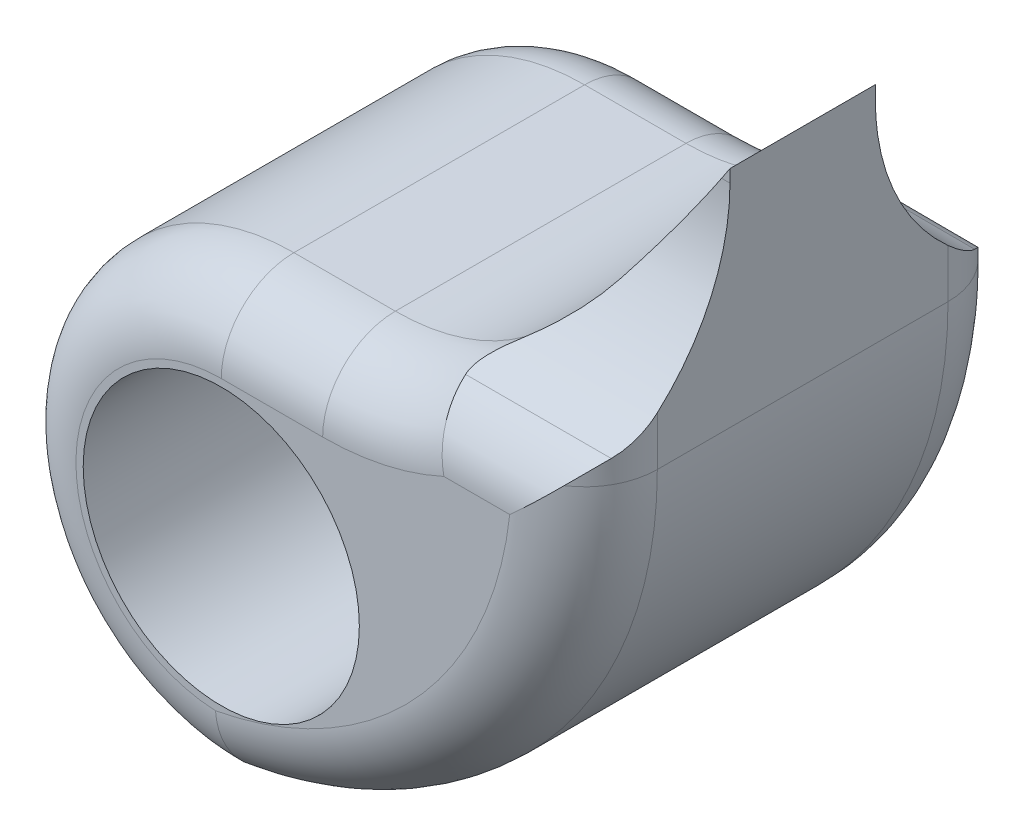
ISO-10303-21;
HEADER;
FILE_DESCRIPTION(('STEP AP214'),'2;1');
FILE_NAME('part.step','',(''),(''),'','','');
FILE_SCHEMA(('AUTOMOTIVE_DESIGN { 1 0 10303 214 1 1 1 1 }'));
ENDSEC;
DATA;
#1=APPLICATION_CONTEXT('core data for automotive mechanical design processes');
#2=APPLICATION_PROTOCOL_DEFINITION('international standard','automotive_design',2000,#1);
#3=PRODUCT_CONTEXT('',#1,'mechanical');
#4=PRODUCT('Part','Part','',(#3));
#5=PRODUCT_RELATED_PRODUCT_CATEGORY('part','',(#4));
#6=PRODUCT_DEFINITION_FORMATION('','',#4);
#7=PRODUCT_DEFINITION_CONTEXT('part definition',#1,'design');
#8=PRODUCT_DEFINITION('design','',#6,#7);
#9=PRODUCT_DEFINITION_SHAPE('','',#8);
#10=(LENGTH_UNIT() NAMED_UNIT(*) SI_UNIT(.MILLI.,.METRE.));
#11=(NAMED_UNIT(*) PLANE_ANGLE_UNIT() SI_UNIT($,.RADIAN.));
#12=(NAMED_UNIT(*) SI_UNIT($,.STERADIAN.) SOLID_ANGLE_UNIT());
#13=UNCERTAINTY_MEASURE_WITH_UNIT(LENGTH_MEASURE(1.E-05),#10,'distance_accuracy_value','');
#14=(GEOMETRIC_REPRESENTATION_CONTEXT(3) GLOBAL_UNCERTAINTY_ASSIGNED_CONTEXT((#13)) GLOBAL_UNIT_ASSIGNED_CONTEXT((#10,
#11,#12)) REPRESENTATION_CONTEXT('',''));
#15=CARTESIAN_POINT('',(0.,0.,0.));
#16=DIRECTION('',(0.,0.,1.));
#17=DIRECTION('',(1.,0.,0.));
#18=AXIS2_PLACEMENT_3D('',#15,#16,#17);
#19=CARTESIAN_POINT('',(5.,6.00246294667528,6.));
#20=DIRECTION('',(0.832569123861893,-0.553921162253114,0.));
#21=DIRECTION('',(0.553921162253114,0.832569123861893,0.));
#22=AXIS2_PLACEMENT_3D('',#19,#20,#21);
#23=PLANE('',#22);
#24=CARTESIAN_POINT('',(4.87991545972652,5.8219703291371,-0.999999999999999));
#25=DIRECTION('',(0.832569123861893,-0.553921162253114,0.));
#26=DIRECTION('',(0.553921162253114,0.832569123861893,0.));
#27=AXIS2_PLACEMENT_3D('',#24,#25,#26);
#28=ELLIPSE('',#27,3.59507871271554,3.);
#29=CARTESIAN_POINT('',(4.87991545972652,5.8219703291371,2.));
#30=VERTEX_POINT('',#29);
#31=CARTESIAN_POINT('',(3.89276431969464,4.33823651324066,1.60546508920253));
#32=VERTEX_POINT('',#31);
#33=EDGE_CURVE('E203',#30,#32,#28,.T.);
#34=ORIENTED_EDGE('',*,*,#33,.T.);
#35=DIRECTION('',(0.,0.,-1.));
#36=VECTOR('',#35,1.);
#37=CARTESIAN_POINT('',(3.89276431969464,4.33823651324066,4.));
#38=LINE('',#37,#36);
#39=CARTESIAN_POINT('',(3.89276431969464,4.33823651324066,4.39628497308531));
#40=VERTEX_POINT('',#39);
#41=EDGE_CURVE('E198',#32,#40,#38,.F.);
#42=ORIENTED_EDGE('',*,*,#41,.T.);
#43=CARTESIAN_POINT('',(4.88421126607545,5.82842712474619,7.));
#44=DIRECTION('',(0.832569123861893,-0.553921162253114,0.));
#45=DIRECTION('',(0.553921162253114,0.832569123861893,0.));
#46=AXIS2_PLACEMENT_3D('',#43,#44,#45);
#47=ELLIPSE('',#46,3.60330441523513,3.);
#48=CARTESIAN_POINT('',(4.88421126607545,5.82842712474619,4.));
#49=VERTEX_POINT('',#48);
#50=EDGE_CURVE('E209',#40,#49,#47,.T.);
#51=ORIENTED_EDGE('',*,*,#50,.T.);
#52=DIRECTION('',(-0.553921162253114,-0.832569123861893,0.));
#53=VECTOR('',#52,1.);
#54=CARTESIAN_POINT('',(5.,6.00246294667528,4.));
#55=LINE('',#54,#53);
#56=CARTESIAN_POINT('',(5.,6.00246294667528,4.));
#57=VERTEX_POINT('',#56);
#58=EDGE_CURVE('E178',#57,#49,#55,.T.);
#59=ORIENTED_EDGE('',*,*,#58,.F.);
#60=DIRECTION('',(0.,0.,-1.));
#61=VECTOR('',#60,1.);
#62=CARTESIAN_POINT('',(5.,6.00246294667528,6.));
#63=LINE('',#62,#61);
#64=CARTESIAN_POINT('',(5.,6.00246294667528,2.));
#65=VERTEX_POINT('',#64);
#66=EDGE_CURVE('E175',#57,#65,#63,.T.);
#67=ORIENTED_EDGE('',*,*,#66,.T.);
#68=DIRECTION('',(0.553921162253114,0.832569123861893,0.));
#69=VECTOR('',#68,1.);
#70=CARTESIAN_POINT('',(3.00241479370527,3.,2.));
#71=LINE('',#70,#69);
#72=EDGE_CURVE('E159',#30,#65,#71,.T.);
#73=ORIENTED_EDGE('',*,*,#72,.F.);
#74=EDGE_LOOP('',(#34,#42,#51,#59,#67,#73));
#75=FACE_BOUND('',#74,.T.);
#76=ADVANCED_FACE('F35',(#75),#23,.F.);
#77=CARTESIAN_POINT('',(0.,3.,6.));
#78=DIRECTION('',(0.,-1.,0.));
#79=DIRECTION('',(0.,0.,-1.));
#80=AXIS2_PLACEMENT_3D('',#77,#78,#79);
#81=PLANE('',#80);
#82=DIRECTION('',(0.,0.,-1.));
#83=VECTOR('',#82,1.);
#84=CARTESIAN_POINT('',(1.39505694810896,3.,2.));
#85=LINE('',#84,#83);
#86=CARTESIAN_POINT('',(1.39505694810896,3.,5.));
#87=VERTEX_POINT('',#86);
#88=CARTESIAN_POINT('',(1.39505694810896,3.,1.));
#89=VERTEX_POINT('',#88);
#90=EDGE_CURVE('E196',#87,#89,#85,.T.);
#91=ORIENTED_EDGE('',*,*,#90,.T.);
#92=DIRECTION('',(-1.,0.,0.));
#93=VECTOR('',#92,1.);
#94=CARTESIAN_POINT('',(0.,3.,1.));
#95=LINE('',#94,#93);
#96=CARTESIAN_POINT('',(0.,3.,1.));
#97=VERTEX_POINT('',#96);
#98=EDGE_CURVE('E11',#89,#97,#95,.T.);
#99=ORIENTED_EDGE('',*,*,#98,.T.);
#100=DIRECTION('',(0.,0.,-1.));
#101=VECTOR('',#100,1.);
#102=CARTESIAN_POINT('',(0.,3.,6.));
#103=LINE('',#102,#101);
#104=CARTESIAN_POINT('',(0.,3.,5.));
#105=VERTEX_POINT('',#104);
#106=EDGE_CURVE('E186',#105,#97,#103,.T.);
#107=ORIENTED_EDGE('',*,*,#106,.F.);
#108=DIRECTION('',(-1.,0.,0.));
#109=VECTOR('',#108,1.);
#110=CARTESIAN_POINT('',(0.,3.,5.));
#111=LINE('',#110,#109);
#112=EDGE_CURVE('E660',#105,#87,#111,.F.);
#113=ORIENTED_EDGE('',*,*,#112,.T.);
#114=EDGE_LOOP('',(#91,#99,#107,#113));
#115=FACE_BOUND('',#114,.T.);
#116=ADVANCED_FACE('F403',(#115),#81,.F.);
#117=CARTESIAN_POINT('',(0.,0.,6.));
#118=DIRECTION('',(0.,0.,-1.));
#119=DIRECTION('',(-1.,0.,0.));
#120=AXIS2_PLACEMENT_3D('',#117,#118,#119);
#121=CYLINDRICAL_SURFACE('',#120,3.);
#122=ORIENTED_EDGE('',*,*,#106,.T.);
#123=CARTESIAN_POINT('',(0.,0.,1.));
#124=DIRECTION('',(0.,0.,-1.));
#125=DIRECTION('',(-1.,0.,0.));
#126=AXIS2_PLACEMENT_3D('',#123,#124,#125);
#127=CIRCLE('',#126,3.);
#128=CARTESIAN_POINT('',(0.,-3.,1.));
#129=VERTEX_POINT('',#128);
#130=EDGE_CURVE('E329',#97,#129,#127,.F.);
#131=ORIENTED_EDGE('',*,*,#130,.T.);
#132=DIRECTION('',(0.,0.,-1.));
#133=VECTOR('',#132,1.);
#134=CARTESIAN_POINT('',(0.,-3.,6.));
#135=LINE('',#134,#133);
#136=CARTESIAN_POINT('',(0.,-3.,5.));
#137=VERTEX_POINT('',#136);
#138=EDGE_CURVE('E182',#137,#129,#135,.T.);
#139=ORIENTED_EDGE('',*,*,#138,.F.);
#140=CARTESIAN_POINT('',(0.,0.,5.));
#141=DIRECTION('',(0.,0.,-1.));
#142=DIRECTION('',(-1.,0.,0.));
#143=AXIS2_PLACEMENT_3D('',#140,#141,#142);
#144=CIRCLE('',#143,3.);
#145=EDGE_CURVE('E658',#137,#105,#144,.T.);
#146=ORIENTED_EDGE('',*,*,#145,.T.);
#147=EDGE_LOOP('',(#122,#131,#139,#146));
#148=FACE_BOUND('',#147,.T.);
#149=ADVANCED_FACE('F407',(#148),#121,.T.);
#150=CARTESIAN_POINT('',(5.,3.,6.));
#151=DIRECTION('',(-1.,0.,0.));
#152=DIRECTION('',(0.,0.,1.));
#153=AXIS2_PLACEMENT_3D('',#150,#151,#152);
#154=PLANE('',#153);
#155=DIRECTION('',(0.,0.,-1.));
#156=VECTOR('',#155,1.);
#157=CARTESIAN_POINT('',(5.,2.91607978309962,6.));
#158=LINE('',#157,#156);
#159=CARTESIAN_POINT('',(5.,2.91607978309962,5.));
#160=VERTEX_POINT('',#159);
#161=CARTESIAN_POINT('',(5.,2.91607978309962,1.));
#162=VERTEX_POINT('',#161);
#163=EDGE_CURVE('E211',#160,#162,#158,.T.);
#164=ORIENTED_EDGE('',*,*,#163,.T.);
#165=DIRECTION('',(0.,-1.,0.));
#166=VECTOR('',#165,1.);
#167=CARTESIAN_POINT('',(5.,2.91607978309962,1.));
#168=LINE('',#167,#166);
#169=CARTESIAN_POINT('',(5.,3.58547500913535,1.));
#170=VERTEX_POINT('',#169);
#171=EDGE_CURVE('E314',#162,#170,#168,.F.);
#172=ORIENTED_EDGE('',*,*,#171,.T.);
#173=CARTESIAN_POINT('',(5.,5.82155627851476,-0.999999999999999));
#174=DIRECTION('',(-1.,0.,0.));
#175=DIRECTION('',(0.,-1.,0.));
#176=AXIS2_PLACEMENT_3D('',#173,#174,#175);
#177=ELLIPSE('',#176,3.00001783292784,3.);
#178=CARTESIAN_POINT('',(5.,5.82155627851476,2.));
#179=VERTEX_POINT('',#178);
#180=EDGE_CURVE('E177',#170,#179,#177,.T.);
#181=ORIENTED_EDGE('',*,*,#180,.T.);
#182=DIRECTION('',(0.,-1.,0.));
#183=VECTOR('',#182,1.);
#184=CARTESIAN_POINT('',(5.,6.00246294667528,2.));
#185=LINE('',#184,#183);
#186=EDGE_CURVE('E162',#65,#179,#185,.T.);
#187=ORIENTED_EDGE('',*,*,#186,.F.);
#188=ORIENTED_EDGE('',*,*,#66,.F.);
#189=DIRECTION('',(0.,1.,0.));
#190=VECTOR('',#189,1.);
#191=CARTESIAN_POINT('',(5.,3.,4.));
#192=LINE('',#191,#190);
#193=CARTESIAN_POINT('',(5.,5.82842712474619,4.));
#194=VERTEX_POINT('',#193);
#195=EDGE_CURVE('E662',#194,#57,#192,.T.);
#196=ORIENTED_EDGE('',*,*,#195,.F.);
#197=CARTESIAN_POINT('',(5.,5.82842712474619,7.));
#198=DIRECTION('',(-1.,0.,0.));
#199=DIRECTION('',(0.,0.,1.));
#200=AXIS2_PLACEMENT_3D('',#197,#198,#199);
#201=CIRCLE('',#200,3.);
#202=CARTESIAN_POINT('',(5.,3.5923591472464,5.));
#203=VERTEX_POINT('',#202);
#204=EDGE_CURVE('E206',#194,#203,#201,.T.);
#205=ORIENTED_EDGE('',*,*,#204,.T.);
#206=DIRECTION('',(0.,1.,0.));
#207=VECTOR('',#206,1.);
#208=CARTESIAN_POINT('',(5.,3.,5.));
#209=LINE('',#208,#207);
#210=EDGE_CURVE('E450',#203,#160,#209,.F.);
#211=ORIENTED_EDGE('',*,*,#210,.T.);
#212=EDGE_LOOP('',(#164,#172,#181,#187,#188,#196,#205,#211));
#213=FACE_BOUND('',#212,.T.);
#214=ADVANCED_FACE('F173',(#213),#154,.F.);
#215=CARTESIAN_POINT('',(0.,0.,6.));
#216=DIRECTION('',(0.,0.,-1.));
#217=DIRECTION('',(-1.,0.,0.));
#218=AXIS2_PLACEMENT_3D('',#215,#216,#217);
#219=PLANE('',#218);
#220=CARTESIAN_POINT('',(1.39505694810896,6.,6.));
#221=DIRECTION('',(0.,0.,-1.));
#222=DIRECTION('',(-1.,0.,0.));
#223=AXIS2_PLACEMENT_3D('',#220,#221,#222);
#224=CIRCLE('',#223,4.);
#225=CARTESIAN_POINT('',(3.06295112937948,2.36432550960844,6.));
#226=VERTEX_POINT('',#225);
#227=CARTESIAN_POINT('',(1.39505694810896,2.,6.));
#228=VERTEX_POINT('',#227);
#229=EDGE_CURVE('E651',#226,#228,#224,.T.);
#230=ORIENTED_EDGE('',*,*,#229,.T.);
#231=DIRECTION('',(-1.,0.,0.));
#232=VECTOR('',#231,1.);
#233=CARTESIAN_POINT('',(0.,2.,6.));
#234=LINE('',#233,#232);
#235=CARTESIAN_POINT('',(0.,2.,6.));
#236=VERTEX_POINT('',#235);
#237=EDGE_CURVE('E656',#228,#236,#234,.T.);
#238=ORIENTED_EDGE('',*,*,#237,.T.);
#239=CARTESIAN_POINT('',(0.,0.,6.));
#240=DIRECTION('',(0.,0.,-1.));
#241=DIRECTION('',(-1.,0.,0.));
#242=AXIS2_PLACEMENT_3D('',#239,#240,#241);
#243=CIRCLE('',#242,2.);
#244=CARTESIAN_POINT('',(-0.0793304543605097,-1.99842605042342,6.));
#245=VERTEX_POINT('',#244);
#246=EDGE_CURVE('E653',#236,#245,#243,.F.);
#247=ORIENTED_EDGE('',*,*,#246,.T.);
#248=CARTESIAN_POINT('',(-1.,2.91607978309962,6.));
#249=DIRECTION('',(0.,0.,-1.));
#250=DIRECTION('',(-1.,0.,0.));
#251=AXIS2_PLACEMENT_3D('',#248,#249,#250);
#252=CIRCLE('',#251,5.);
#253=CARTESIAN_POINT('',(3.9694634742278,2.36432550960844,6.));
#254=VERTEX_POINT('',#253);
#255=EDGE_CURVE('E647',#245,#254,#252,.F.);
#256=ORIENTED_EDGE('',*,*,#255,.T.);
#257=DIRECTION('',(1.,0.,0.));
#258=VECTOR('',#257,1.);
#259=CARTESIAN_POINT('',(0.,2.36432550960844,6.));
#260=LINE('',#259,#258);
#261=EDGE_CURVE('E379',#254,#226,#260,.F.);
#262=ORIENTED_EDGE('',*,*,#261,.T.);
#263=EDGE_LOOP('',(#230,#238,#247,#256,#262));
#264=FACE_BOUND('',#263,.T.);
#265=CARTESIAN_POINT('',(0.,0.,6.));
#266=DIRECTION('',(0.,0.,1.));
#267=DIRECTION('',(1.,0.,0.));
#268=AXIS2_PLACEMENT_3D('',#265,#266,#267);
#269=CIRCLE('',#268,1.9);
#270=CARTESIAN_POINT('',(1.9,0.,6.));
#271=VERTEX_POINT('',#270);
#272=EDGE_CURVE('E189',#271,#271,#269,.T.);
#273=ORIENTED_EDGE('',*,*,#272,.F.);
#274=EDGE_LOOP('',(#273));
#275=FACE_BOUND('',#274,.T.);
#276=ADVANCED_FACE('F416',(#264,#275),#219,.F.);
#277=CARTESIAN_POINT('',(0.,0.,0.));
#278=DIRECTION('',(0.,0.,-1.));
#279=DIRECTION('',(-1.,0.,0.));
#280=AXIS2_PLACEMENT_3D('',#277,#278,#279);
#281=PLANE('',#280);
#282=CARTESIAN_POINT('',(0.,0.,0.));
#283=DIRECTION('',(0.,0.,-1.));
#284=DIRECTION('',(-1.,0.,0.));
#285=AXIS2_PLACEMENT_3D('',#282,#283,#284);
#286=CIRCLE('',#285,2.);
#287=CARTESIAN_POINT('',(-0.0793304543605097,-1.99842605042342,0.));
#288=VERTEX_POINT('',#287);
#289=CARTESIAN_POINT('',(0.,2.,0.));
#290=VERTEX_POINT('',#289);
#291=EDGE_CURVE('E320',#288,#290,#286,.T.);
#292=ORIENTED_EDGE('',*,*,#291,.T.);
#293=DIRECTION('',(-1.,0.,0.));
#294=VECTOR('',#293,1.);
#295=CARTESIAN_POINT('',(1.39505694810896,2.,0.));
#296=LINE('',#295,#294);
#297=CARTESIAN_POINT('',(1.39505694810896,2.,0.));
#298=VERTEX_POINT('',#297);
#299=EDGE_CURVE('E316',#290,#298,#296,.F.);
#300=ORIENTED_EDGE('',*,*,#299,.T.);
#301=CARTESIAN_POINT('',(1.39505694810896,6.,0.));
#302=DIRECTION('',(0.,0.,-1.));
#303=DIRECTION('',(-1.,0.,0.));
#304=AXIS2_PLACEMENT_3D('',#301,#302,#303);
#305=CIRCLE('',#304,4.);
#306=CARTESIAN_POINT('',(3.06249128513973,2.36411458765671,0.));
#307=VERTEX_POINT('',#306);
#308=EDGE_CURVE('E325',#298,#307,#305,.F.);
#309=ORIENTED_EDGE('',*,*,#308,.T.);
#310=DIRECTION('',(-0.999994055726055,0.00344797223827679,0.));
#311=VECTOR('',#310,1.);
#312=CARTESIAN_POINT('',(4.99780821200455,2.35744162895472,0.));
#313=LINE('',#312,#311);
#314=CARTESIAN_POINT('',(3.96909185041401,2.36098863549492,0.));
#315=VERTEX_POINT('',#314);
#316=EDGE_CURVE('E327',#307,#315,#313,.F.);
#317=ORIENTED_EDGE('',*,*,#316,.T.);
#318=CARTESIAN_POINT('',(-1.,2.91607978309962,0.));
#319=DIRECTION('',(0.,0.,-1.));
#320=DIRECTION('',(-1.,0.,0.));
#321=AXIS2_PLACEMENT_3D('',#318,#319,#320);
#322=CIRCLE('',#321,5.);
#323=EDGE_CURVE('E323',#315,#288,#322,.T.);
#324=ORIENTED_EDGE('',*,*,#323,.T.);
#325=EDGE_LOOP('',(#292,#300,#309,#317,#324));
#326=FACE_BOUND('',#325,.T.);
#327=CARTESIAN_POINT('',(0.,0.,0.));
#328=DIRECTION('',(0.,0.,1.));
#329=DIRECTION('',(1.,0.,0.));
#330=AXIS2_PLACEMENT_3D('',#327,#328,#329);
#331=CIRCLE('',#330,1.9);
#332=CARTESIAN_POINT('',(1.9,0.,0.));
#333=VERTEX_POINT('',#332);
#334=EDGE_CURVE('E183',#333,#333,#331,.T.);
#335=ORIENTED_EDGE('',*,*,#334,.T.);
#336=EDGE_LOOP('',(#335));
#337=FACE_BOUND('',#336,.T.);
#338=ADVANCED_FACE('F417',(#326,#337),#281,.T.);
#339=CARTESIAN_POINT('',(0.,0.,6.));
#340=DIRECTION('',(0.,0.,1.));
#341=DIRECTION('',(1.,0.,0.));
#342=AXIS2_PLACEMENT_3D('',#339,#340,#341);
#343=CYLINDRICAL_SURFACE('',#342,1.9);
#344=ORIENTED_EDGE('',*,*,#334,.F.);
#345=EDGE_LOOP('',(#344));
#346=FACE_BOUND('',#345,.T.);
#347=ORIENTED_EDGE('',*,*,#272,.T.);
#348=EDGE_LOOP('',(#347));
#349=FACE_BOUND('',#348,.T.);
#350=ADVANCED_FACE('F420',(#346,#349),#343,.F.);
#351=CARTESIAN_POINT('',(0.,0.,4.));
#352=DIRECTION('',(0.,0.,1.));
#353=DIRECTION('',(1.,0.,0.));
#354=AXIS2_PLACEMENT_3D('',#351,#352,#353);
#355=PLANE('',#354);
#356=ORIENTED_EDGE('',*,*,#58,.T.);
#357=DIRECTION('',(-1.,0.,0.));
#358=VECTOR('',#357,1.);
#359=CARTESIAN_POINT('',(5.,5.82842712474619,4.));
#360=LINE('',#359,#358);
#361=EDGE_CURVE('E201',#49,#194,#360,.F.);
#362=ORIENTED_EDGE('',*,*,#361,.T.);
#363=ORIENTED_EDGE('',*,*,#195,.T.);
#364=EDGE_LOOP('',(#356,#362,#363));
#365=FACE_BOUND('',#364,.T.);
#366=ADVANCED_FACE('F427',(#365),#355,.T.);
#367=CARTESIAN_POINT('',(0.,0.,2.));
#368=DIRECTION('',(0.,0.,1.));
#369=DIRECTION('',(1.,0.,0.));
#370=AXIS2_PLACEMENT_3D('',#367,#368,#369);
#371=PLANE('',#370);
#372=ORIENTED_EDGE('',*,*,#186,.T.);
#373=DIRECTION('',(0.999994055726055,-0.00344797223827679,0.));
#374=VECTOR('',#373,1.);
#375=CARTESIAN_POINT('',(0.0201318876778427,5.83872682758278,2.));
#376=LINE('',#375,#374);
#377=EDGE_CURVE('E164',#179,#30,#376,.F.);
#378=ORIENTED_EDGE('',*,*,#377,.T.);
#379=ORIENTED_EDGE('',*,*,#72,.T.);
#380=EDGE_LOOP('',(#372,#378,#379));
#381=FACE_BOUND('',#380,.T.);
#382=ADVANCED_FACE('F161',(#381),#371,.F.);
#383=CARTESIAN_POINT('',(0.,5.82842712474619,7.));
#384=DIRECTION('',(1.,0.,0.));
#385=DIRECTION('',(0.,0.,-1.));
#386=AXIS2_PLACEMENT_3D('',#383,#384,#385);
#387=CYLINDRICAL_SURFACE('',#386,3.);
#388=CARTESIAN_POINT('',(3.89276431969464,4.33823651324066,4.39628497308531));
#389=CARTESIAN_POINT('',(3.83977937249417,4.25862455525034,4.44185472319309));
#390=CARTESIAN_POINT('',(3.78379335400496,4.18270073973871,4.49014870818531));
#391=CARTESIAN_POINT('',(3.66667020364761,4.0382595686562,4.59104728764921));
#392=CARTESIAN_POINT('',(3.6055411630411,3.96973095247981,4.6436451076611));
#393=CARTESIAN_POINT('',(3.47895182447921,3.84000553957355,4.75204332682077));
#394=CARTESIAN_POINT('',(3.41350119445207,3.77879318418802,4.80783654268931));
#395=CARTESIAN_POINT('',(3.27862351863612,3.66332226380861,4.92180318658364));
#396=CARTESIAN_POINT('',(3.20919517406906,3.60906598900891,4.97997739024324));
#397=CARTESIAN_POINT('',(3.06718064685326,3.50769961688877,5.09732004263422));
#398=CARTESIAN_POINT('',(2.99462022725075,3.46054175931748,5.15647856880733));
#399=CARTESIAN_POINT('',(2.84590572394945,3.37273913670971,5.27516885582386));
#400=CARTESIAN_POINT('',(2.76975049050928,3.33209647397203,5.33470073072497));
#401=CARTESIAN_POINT('',(2.61347459248378,3.25719429284665,5.45285466261588));
#402=CARTESIAN_POINT('',(2.53334808187432,3.22294456118635,5.51147520074134));
#403=CARTESIAN_POINT('',(2.36855891434505,3.16097763643857,5.62562633234086));
#404=CARTESIAN_POINT('',(2.28390127117493,3.13325339901458,5.68116020795102));
#405=CARTESIAN_POINT('',(2.12584104316258,3.08945251985646,5.77518958418095));
#406=CARTESIAN_POINT('',(2.05350484401014,3.07215731241993,5.81488683474735));
#407=CARTESIAN_POINT('',(1.90453411741634,3.04261104596817,5.88613852989515));
#408=CARTESIAN_POINT('',(1.82794352461617,3.03031650658251,5.91776223415017));
#409=CARTESIAN_POINT('',(1.69230135168121,3.01422695715789,5.96044634206994));
#410=CARTESIAN_POINT('',(1.6345082853236,3.0090061771795,5.97480208115693));
#411=CARTESIAN_POINT('',(1.51629844436496,3.00184497945112,5.99476759467081));
#412=CARTESIAN_POINT('',(1.45585409905294,2.99996017509158,6.0002289759386));
#413=CARTESIAN_POINT('',(1.39505694810892,2.99999999999999,5.99999999999985));
#414=B_SPLINE_CURVE_WITH_KNOTS('',3,(#388,#389,#390,#391,#392,#393,#394,#395,#396,#397,#398,
#399,#400,#401,#402,#403,#404,#405,#406,#407,#408,#409,#410,#411,#412,#413),.UNSPECIFIED.,.F.,
.F.,(4,2,2,2,2,2,2,2,2,2,2,2,4),(0.,0.317518852050169,0.634547188079628,0.950888865943367,
1.26733442896142,1.58154526303849,1.89585728229567,2.21064659436109,2.52509451347435,
2.7776224706959,3.02790520020206,3.20651316601057,3.38807158029751),.UNSPECIFIED.);
#415=CARTESIAN_POINT('',(3.184823839118,3.59235914724629,4.99999999999999));
#416=VERTEX_POINT('',#415);
#417=EDGE_CURVE('E168',#416,#40,#414,.F.);
#418=ORIENTED_EDGE('',*,*,#417,.F.);
#419=CARTESIAN_POINT('',(3.18482383911792,3.59235914724639,5.));
#420=CARTESIAN_POINT('',(3.15814887247526,3.57248134527755,5.02223792086796));
#421=CARTESIAN_POINT('',(3.13178840338967,3.55269737668566,5.04501067630843));
#422=CARTESIAN_POINT('',(3.0799991940612,3.51284706403335,5.09236393610155));
#423=CARTESIAN_POINT('',(3.05459068209903,3.49278099427952,5.11696664115916));
#424=CARTESIAN_POINT('',(3.00369187165434,3.45069608545062,5.17034104001226));
#425=CARTESIAN_POINT('',(2.97839570788625,3.42866244899562,5.19928888851102));
#426=CARTESIAN_POINT('',(2.93233818357355,3.38420591039339,5.26011782866495));
#427=CARTESIAN_POINT('',(2.91154427919077,3.3617871594645,5.29197532855581));
#428=CARTESIAN_POINT('',(2.8862169485769,3.3271012262044,5.34354999227428));
#429=CARTESIAN_POINT('',(2.87864478137947,3.31504893795758,5.36188068654321));
#430=CARTESIAN_POINT('',(2.86692115834876,3.29104983234076,5.39931254169792));
#431=CARTESIAN_POINT('',(2.86271767731696,3.27910434588392,5.4183970089839));
#432=CARTESIAN_POINT('',(2.85954769834123,3.26104844784635,5.4479979307336));
#433=CARTESIAN_POINT('',(2.85904485411557,3.25484927209908,5.4582996071517));
#434=CARTESIAN_POINT('',(2.85932585532147,3.24251586557685,5.47907535040752));
#435=CARTESIAN_POINT('',(2.86012388038647,3.23638309390303,5.48955006848415));
#436=CARTESIAN_POINT('',(2.86163142858406,3.23035091339288,5.5));
#437=B_SPLINE_CURVE_WITH_KNOTS('',3,(#419,#420,#421,#422,#423,#424,#425,#426,#427,#428,#429,
#430,#431,#432,#433,#434,#435,#436),.UNSPECIFIED.,.F.,.F.,(4,2,2,2,2,2,2,2,4),(0.,
0.12010571516902,0.242035351400587,0.374820922201789,0.506612016005854,0.576055657562473,
0.644404964571219,0.680441634631158,0.716873741792013),.UNSPECIFIED.);
#438=CARTESIAN_POINT('',(2.86163142858406,3.23035091339287,5.5));
#439=VERTEX_POINT('',#438);
#440=EDGE_CURVE('E443',#416,#439,#437,.T.);
#441=ORIENTED_EDGE('',*,*,#440,.T.);
#442=DIRECTION('',(1.,0.,0.));
#443=VECTOR('',#442,1.);
#444=CARTESIAN_POINT('',(0.,3.23035091339287,5.5));
#445=LINE('',#444,#443);
#446=CARTESIAN_POINT('',(4.86602540378449,3.23035091339287,5.5));
#447=VERTEX_POINT('',#446);
#448=EDGE_CURVE('E452',#439,#447,#445,.T.);
#449=ORIENTED_EDGE('',*,*,#448,.T.);
#450=CARTESIAN_POINT('',(4.86602540378449,3.23035091339288,5.5));
#451=CARTESIAN_POINT('',(4.88154238236497,3.24586194804985,5.47312662632835));
#452=CARTESIAN_POINT('',(4.89559405171349,3.26214440758727,5.44589641166632));
#453=CARTESIAN_POINT('',(4.9208562628336,3.29616088546812,5.39106730236851));
#454=CARTESIAN_POINT('',(4.93206957728158,3.31389346466208,5.36346879547102));
#455=CARTESIAN_POINT('',(4.96123162565486,3.36843796076301,5.28166620969494));
#456=CARTESIAN_POINT('',(4.97531425432611,3.40722580376958,5.22735185168078));
#457=CARTESIAN_POINT('',(4.98997053509388,3.47081995714591,5.14444369895177));
#458=CARTESIAN_POINT('',(4.99376823507948,3.49413984503911,5.11518987465206));
#459=CARTESIAN_POINT('',(4.99879480176038,3.54223500825791,5.05712540675718));
#460=CARTESIAN_POINT('',(4.99999505885074,3.56702343305372,5.02832313403239));
#461=CARTESIAN_POINT('',(5.,3.5923591472464,5.));
#462=B_SPLINE_CURVE_WITH_KNOTS('',3,(#450,#451,#452,#453,#454,#455,#456,#457,#458,#459,#460,
#461),.UNSPECIFIED.,.F.,.F.,(4,2,2,2,2,4),(0.,0.103976758370557,0.207851550537422,
0.411431518668696,0.52414906425712,0.638101951910164),.UNSPECIFIED.);
#463=EDGE_CURVE('E376',#447,#203,#462,.T.);
#464=ORIENTED_EDGE('',*,*,#463,.T.);
#465=ORIENTED_EDGE('',*,*,#204,.F.);
#466=ORIENTED_EDGE('',*,*,#361,.F.);
#467=ORIENTED_EDGE('',*,*,#50,.F.);
#468=EDGE_LOOP('',(#418,#441,#449,#464,#465,#466,#467));
#469=FACE_BOUND('',#468,.T.);
#470=ADVANCED_FACE('F233',(#469),#387,.F.);
#471=CARTESIAN_POINT('',(1.39505694810896,6.,6.));
#472=DIRECTION('',(0.,0.,1.));
#473=DIRECTION('',(1.,0.,0.));
#474=AXIS2_PLACEMENT_3D('',#471,#472,#473);
#475=CYLINDRICAL_SURFACE('',#474,3.);
#476=CARTESIAN_POINT('',(3.89276431969464,4.33823651324066,1.60546508920253));
#477=CARTESIAN_POINT('',(3.83980280582881,4.25865913366388,1.55993513882468));
#478=CARTESIAN_POINT('',(3.78384737360799,4.18277468460517,1.51166412183856));
#479=CARTESIAN_POINT('',(3.66680906499894,4.03842349873449,1.41077497078089));
#480=CARTESIAN_POINT('',(3.60573437933852,3.96994529948507,1.35816378297033));
#481=CARTESIAN_POINT('',(3.47938444159621,3.84043266220568,1.24978353124635));
#482=CARTESIAN_POINT('',(3.41412582414749,3.77937123787362,1.19402706724494));
#483=CARTESIAN_POINT('',(3.27968299654902,3.66418651618762,1.08008954248297));
#484=CARTESIAN_POINT('',(3.21049745855341,3.61006558609323,1.02190766338174));
#485=CARTESIAN_POINT('',(3.0690377842788,3.50895715253966,0.904492790259504));
#486=CARTESIAN_POINT('',(2.99678933223866,3.46192131238532,0.845270315592093));
#487=CARTESIAN_POINT('',(2.84878272587129,3.37434211183944,0.726362607653325));
#488=CARTESIAN_POINT('',(2.7730235730266,3.33380061337045,0.666677246796517));
#489=CARTESIAN_POINT('',(2.61755697734354,3.25902144560633,0.547990298459437));
#490=CARTESIAN_POINT('',(2.53783914609142,3.22480160995406,0.488991072469048));
#491=CARTESIAN_POINT('',(2.37399249214122,3.16286252795234,0.373853994971432));
#492=CARTESIAN_POINT('',(2.28986822308576,3.13513672669253,0.317713303333782));
#493=CARTESIAN_POINT('',(2.12314432623742,3.08851047616079,0.216177327470284));
#494=CARTESIAN_POINT('',(2.04101003593291,3.06906438792932,0.17027557583169));
#495=CARTESIAN_POINT('',(1.87078059709399,3.03671445037384,0.0892335761997494));
#496=CARTESIAN_POINT('',(1.78274708382797,3.02375218791514,0.0539984152348801));
#497=CARTESIAN_POINT('',(1.65082380339574,3.01063916134976,0.0168316467948252));
#498=CARTESIAN_POINT('',(1.60935012122489,3.00736495868119,0.007248490681346));
#499=CARTESIAN_POINT('',(1.56729298346659,3.00494828957424,0.));
#500=B_SPLINE_CURVE_WITH_KNOTS('',3,(#476,#477,#478,#479,#480,#481,#482,#483,#484,#485,#486,
#487,#488,#489,#490,#491,#492,#493,#494,#495,#496,#497,#498,#499),.UNSPECIFIED.,.F.,.F.,(4,2,2,
2,2,2,2,2,2,2,2,4),(0.,0.317353253523584,0.634208099912081,0.94987313243706,1.26564554704945,
1.57915524809795,1.8927546718773,2.20722569441177,2.52137791679724,2.80914567560195,
3.09427199855078,3.22222780511188),.UNSPECIFIED.);
#501=CARTESIAN_POINT('',(3.1839860841132,3.59173661192225,1.00000000000001));
#502=VERTEX_POINT('',#501);
#503=EDGE_CURVE('E212',#502,#32,#500,.F.);
#504=ORIENTED_EDGE('',*,*,#503,.F.);
#505=CARTESIAN_POINT('',(1.39505694810896,6.,1.));
#506=DIRECTION('',(0.,0.,-1.));
#507=DIRECTION('',(-1.,0.,0.));
#508=AXIS2_PLACEMENT_3D('',#505,#506,#507);
#509=CIRCLE('',#508,3.);
#510=EDGE_CURVE('E46',#502,#89,#509,.T.);
#511=ORIENTED_EDGE('',*,*,#510,.T.);
#512=ORIENTED_EDGE('',*,*,#90,.F.);
#513=CARTESIAN_POINT('',(1.39505694810896,6.,5.));
#514=DIRECTION('',(0.,0.,-1.));
#515=DIRECTION('',(-1.,0.,0.));
#516=AXIS2_PLACEMENT_3D('',#513,#514,#515);
#517=CIRCLE('',#516,3.);
#518=EDGE_CURVE('E448',#87,#416,#517,.F.);
#519=ORIENTED_EDGE('',*,*,#518,.T.);
#520=ORIENTED_EDGE('',*,*,#417,.T.);
#521=ORIENTED_EDGE('',*,*,#41,.F.);
#522=EDGE_LOOP('',(#504,#511,#512,#519,#520,#521));
#523=FACE_BOUND('',#522,.T.);
#524=ADVANCED_FACE('F225',(#523),#475,.F.);
#525=CARTESIAN_POINT('',(5.00975233820411,5.8215226525235,-0.999999999999999));
#526=DIRECTION('',(0.999994055726055,-0.00344797223827679,0.));
#527=DIRECTION('',(0.00344797223827679,0.999994055726055,0.));
#528=AXIS2_PLACEMENT_3D('',#525,#526,#527);
#529=CYLINDRICAL_SURFACE('',#528,3.);
#530=ORIENTED_EDGE('',*,*,#180,.F.);
#531=CARTESIAN_POINT('',(5.,3.58547500913535,1.));
#532=CARTESIAN_POINT('',(5.00000179433018,3.55669581720317,0.967840682279425));
#533=CARTESIAN_POINT('',(4.99844775445451,3.52860720182796,0.935017991999093));
#534=CARTESIAN_POINT('',(4.99185821801216,3.4739573603603,0.868304242054488));
#535=CARTESIAN_POINT('',(4.98681233312382,3.44740094869276,0.834410283247736));
#536=CARTESIAN_POINT('',(4.97305479782106,3.39683421453748,0.766939815941447));
#537=CARTESIAN_POINT('',(4.9644466733762,3.37277426245193,0.733379781454431));
#538=CARTESIAN_POINT('',(4.943297561789,3.32665088926012,0.666193750615079));
#539=CARTESIAN_POINT('',(4.93076345916641,3.30458405966042,0.632567971347749));
#540=CARTESIAN_POINT('',(4.90887647726522,3.27313790819366,0.582538518359081));
#541=CARTESIAN_POINT('',(4.90107950180126,3.26294458466795,0.565953041446889));
#542=CARTESIAN_POINT('',(4.88438151067365,3.24304425152645,0.532864962793912));
#543=CARTESIAN_POINT('',(4.87547331168596,3.23334104298732,0.516363702786314));
#544=CARTESIAN_POINT('',(4.86602540378511,3.22392656682691,0.49999999999992));
#545=B_SPLINE_CURVE_WITH_KNOTS('',3,(#531,#532,#533,#534,#535,#536,#537,#538,#539,#540,#541,
#542,#543,#544),.UNSPECIFIED.,.F.,.F.,(4,2,2,2,2,2,4),(0.,0.129482629674841,0.259352138671123,
0.385686428498668,0.511800409646153,0.574682570475906,0.637994623065249),.UNSPECIFIED.);
#546=CARTESIAN_POINT('',(4.86602540378449,3.22392656682722,0.500000000000001));
#547=VERTEX_POINT('',#546);
#548=EDGE_CURVE('E245',#170,#547,#545,.T.);
#549=ORIENTED_EDGE('',*,*,#548,.T.);
#550=DIRECTION('',(0.999994055726055,-0.00344797223827679,0.));
#551=VECTOR('',#550,1.);
#552=CARTESIAN_POINT('',(5.00079424355444,3.22346188484691,0.500000000000001));
#553=LINE('',#552,#551);
#554=CARTESIAN_POINT('',(2.86254442884744,3.23083455467169,0.500000000000001));
#555=VERTEX_POINT('',#554);
#556=EDGE_CURVE('E246',#547,#555,#553,.F.);
#557=ORIENTED_EDGE('',*,*,#556,.T.);
#558=CARTESIAN_POINT('',(2.86254442884744,3.23083455467169,0.5));
#559=CARTESIAN_POINT('',(2.8594722097225,3.24296210666729,0.521010655123569));
#560=CARTESIAN_POINT('',(2.85934901875629,3.25541645751738,0.541970824758045));
#561=CARTESIAN_POINT('',(2.86378163550082,3.28029806315794,0.582760740686766));
#562=CARTESIAN_POINT('',(2.86822617654153,3.29271891106315,0.602605517703874));
#563=CARTESIAN_POINT('',(2.8833084055815,3.32302773927569,0.649856021557607));
#564=CARTESIAN_POINT('',(2.89583191674636,3.3408634973142,0.676650639803686));
#565=CARTESIAN_POINT('',(2.92542560594747,3.37646499915479,0.72846173675829));
#566=CARTESIAN_POINT('',(2.94258312603913,3.39422193125836,0.753430931477546));
#567=CARTESIAN_POINT('',(2.97747226206838,3.42741297084513,0.798722206016186));
#568=CARTESIAN_POINT('',(2.99491362129093,3.4428804051444,0.819249127001804));
#569=CARTESIAN_POINT('',(3.03122708236581,3.47369839652774,0.859124651267779));
#570=CARTESIAN_POINT('',(3.05010066310951,3.48904881428334,0.878471998327368));
#571=CARTESIAN_POINT('',(3.08785069647128,3.51894887805453,0.915252538964523));
#572=CARTESIAN_POINT('',(3.10668015357512,3.53350031534381,0.932733074871061));
#573=CARTESIAN_POINT('',(3.1449343717238,3.56259775449277,0.966908512841828));
#574=CARTESIAN_POINT('',(3.16435754133212,3.5771436804055,0.983605255028919));
#575=CARTESIAN_POINT('',(3.18398608411314,3.59173661192232,0.999999999999994));
#576=B_SPLINE_CURVE_WITH_KNOTS('',3,(#558,#559,#560,#561,#562,#563,#564,#565,#566,#567,#568,
#569,#570,#571,#572,#573,#574,#575),.UNSPECIFIED.,.F.,.F.,(4,2,2,2,2,2,2,2,4),(0.,
0.0728208999291297,0.143909032037648,0.24695206357272,0.352092114025014,0.445203359782971,
0.538412094565591,0.626976794154896,0.715321946647293),.UNSPECIFIED.);
#577=EDGE_CURVE('E240',#555,#502,#576,.T.);
#578=ORIENTED_EDGE('',*,*,#577,.T.);
#579=ORIENTED_EDGE('',*,*,#503,.T.);
#580=ORIENTED_EDGE('',*,*,#33,.F.);
#581=ORIENTED_EDGE('',*,*,#377,.F.);
#582=EDGE_LOOP('',(#530,#549,#557,#578,#579,#580,#581));
#583=FACE_BOUND('',#582,.T.);
#584=ADVANCED_FACE('F228',(#583),#529,.F.);
#585=CARTESIAN_POINT('',(-1.,2.91607978309962,6.));
#586=DIRECTION('',(0.,0.,-1.));
#587=DIRECTION('',(-1.,0.,0.));
#588=AXIS2_PLACEMENT_3D('',#585,#586,#587);
#589=CYLINDRICAL_SURFACE('',#588,6.);
#590=ORIENTED_EDGE('',*,*,#138,.T.);
#591=CARTESIAN_POINT('',(-1.,2.91607978309962,1.));
#592=DIRECTION('',(0.,0.,-1.));
#593=DIRECTION('',(-1.,0.,0.));
#594=AXIS2_PLACEMENT_3D('',#591,#592,#593);
#595=CIRCLE('',#594,6.);
#596=EDGE_CURVE('E315',#129,#162,#595,.F.);
#597=ORIENTED_EDGE('',*,*,#596,.T.);
#598=ORIENTED_EDGE('',*,*,#163,.F.);
#599=CARTESIAN_POINT('',(-1.,2.91607978309962,5.));
#600=DIRECTION('',(0.,0.,-1.));
#601=DIRECTION('',(-1.,0.,0.));
#602=AXIS2_PLACEMENT_3D('',#599,#600,#601);
#603=CIRCLE('',#602,6.);
#604=EDGE_CURVE('E332',#160,#137,#603,.T.);
#605=ORIENTED_EDGE('',*,*,#604,.T.);
#606=EDGE_LOOP('',(#590,#597,#598,#605));
#607=FACE_BOUND('',#606,.T.);
#608=ADVANCED_FACE('F231',(#607),#589,.T.);
#609=CARTESIAN_POINT('',(1.39505694810896,6.,5.));
#610=DIRECTION('',(0.,0.,-1.));
#611=DIRECTION('',(-1.,0.,0.));
#612=AXIS2_PLACEMENT_3D('',#609,#610,#611);
#613=TOROIDAL_SURFACE('',#612,4.,1.);
#614=CARTESIAN_POINT('',(1.39505694810896,2.,5.));
#615=DIRECTION('',(-1.,0.,0.));
#616=DIRECTION('',(0.,0.,1.));
#617=AXIS2_PLACEMENT_3D('',#614,#615,#616);
#618=CIRCLE('',#617,1.);
#619=EDGE_CURVE('E360',#228,#87,#618,.T.);
#620=ORIENTED_EDGE('',*,*,#619,.F.);
#621=ORIENTED_EDGE('',*,*,#229,.F.);
#622=CARTESIAN_POINT('',(2.86163142858406,3.23035091339288,5.5));
#623=CARTESIAN_POINT('',(2.86516133531058,3.21614122374328,5.52461180498429));
#624=CARTESIAN_POINT('',(2.86893370778017,3.20090456509371,5.54857822938141));
#625=CARTESIAN_POINT('',(2.87692368671607,3.1684937453816,5.59507745568024));
#626=CARTESIAN_POINT('',(2.881141205544,3.15131996564508,5.61761053837691));
#627=CARTESIAN_POINT('',(2.89437498198199,3.0971780262177,5.68271602192002));
#628=CARTESIAN_POINT('',(2.90399630222184,3.05749385611169,5.72295903908876));
#629=CARTESIAN_POINT('',(2.92446047177279,2.97216169530644,5.79604958626955));
#630=CARTESIAN_POINT('',(2.93530286559508,2.92651592741371,5.82889986032662));
#631=CARTESIAN_POINT('',(2.95785601859778,2.8304708543152,5.88647926961857));
#632=CARTESIAN_POINT('',(2.96956786945471,2.78006555076865,5.91119797614871));
#633=CARTESIAN_POINT('',(2.99448280821124,2.67157237734361,5.95355731090087));
#634=CARTESIAN_POINT('',(3.00772857767073,2.61319473903686,5.97043030022955));
#635=CARTESIAN_POINT('',(3.03432533925939,2.49449239602849,5.99332418846658));
#636=CARTESIAN_POINT('',(3.04767592007771,2.43417376299914,5.99937610681033));
#637=CARTESIAN_POINT('',(3.06155734653148,2.37070432029709,5.9999848116271));
#638=CARTESIAN_POINT('',(3.06225448905283,2.36751477971463,6.00000007591739));
#639=CARTESIAN_POINT('',(3.06295112937948,2.36432550960844,6.));
#640=B_SPLINE_CURVE_WITH_KNOTS('',3,(#622,#623,#624,#625,#626,#627,#628,#629,#630,#631,#632,
#633,#634,#635,#636,#637,#638,#639),.UNSPECIFIED.,.F.,.F.,(4,2,2,2,2,2,2,2,4),(0.,
0.0858570482402985,0.171697224754282,0.342810389686683,0.513859935536582,0.685128004228614,
0.870762228707681,1.05586346001582,1.06565791990553),.UNSPECIFIED.);
#641=EDGE_CURVE('E219',#439,#226,#640,.T.);
#642=ORIENTED_EDGE('',*,*,#641,.F.);
#643=ORIENTED_EDGE('',*,*,#440,.F.);
#644=ORIENTED_EDGE('',*,*,#518,.F.);
#645=EDGE_LOOP('',(#620,#621,#642,#643,#644));
#646=FACE_BOUND('',#645,.T.);
#647=ADVANCED_FACE('F293',(#646),#613,.T.);
#648=CARTESIAN_POINT('',(0.,2.36432550960844,5.));
#649=DIRECTION('',(1.,0.,0.));
#650=DIRECTION('',(0.,0.,-1.));
#651=AXIS2_PLACEMENT_3D('',#648,#649,#650);
#652=CYLINDRICAL_SURFACE('',#651,1.);
#653=CARTESIAN_POINT('',(4.,2.36432550960844,5.));
#654=DIRECTION('',(0.707106781186547,-0.707106781186547,0.));
#655=DIRECTION('',(0.707106781186547,0.707106781186547,0.));
#656=AXIS2_PLACEMENT_3D('',#653,#654,#655);
#657=ELLIPSE('',#656,1.41421356237309,1.);
#658=CARTESIAN_POINT('',(4.55175427349118,2.91607978309962,5.83400672760129));
#659=VERTEX_POINT('',#658);
#660=EDGE_CURVE('E339',#447,#659,#657,.T.);
#661=ORIENTED_EDGE('',*,*,#660,.F.);
#662=ORIENTED_EDGE('',*,*,#448,.F.);
#663=ORIENTED_EDGE('',*,*,#641,.T.);
#664=ORIENTED_EDGE('',*,*,#261,.F.);
#665=CARTESIAN_POINT('',(4.55175427349118,2.91607978309962,5.83400672760129));
#666=CARTESIAN_POINT('',(4.52458163086383,2.88890607750613,5.85197553995376));
#667=CARTESIAN_POINT('',(4.49680063303811,2.8613258458464,5.86832237506532));
#668=CARTESIAN_POINT('',(4.44022456138811,2.80559847306655,5.89792879927008));
#669=CARTESIAN_POINT('',(4.41143026992741,2.77745177620334,5.91119071252691));
#670=CARTESIAN_POINT('',(4.32400366872675,2.6926965630299,5.9465252963189));
#671=CARTESIAN_POINT('',(4.26410550295961,2.63555009881261,5.96428892846094));
#672=CARTESIAN_POINT('',(4.16567519435797,2.54329740321283,5.98451251142503));
#673=CARTESIAN_POINT('',(4.12777315972974,2.50815636639026,5.99022987778289));
#674=CARTESIAN_POINT('',(4.05137319359477,2.43811737837125,5.99789495493413));
#675=CARTESIAN_POINT('',(4.01287553903442,2.40321932452737,5.99984436759226));
#676=CARTESIAN_POINT('',(3.9726143767524,2.36714660137072,5.9999970155551));
#677=CARTESIAN_POINT('',(3.97103907774909,2.36573585537347,5.99999999907272));
#678=CARTESIAN_POINT('',(3.9694634742278,2.36432550960844,6.));
#679=B_SPLINE_CURVE_WITH_KNOTS('',3,(#665,#666,#667,#668,#669,#670,#671,#672,#673,#674,#675,
#676,#677,#678),.UNSPECIFIED.,.F.,.F.,(4,2,2,2,2,2,4),(0.,0.127167535144899,0.254238950383487,
0.507356047330053,0.66325237793348,0.819078278657674,0.825422242389983),.UNSPECIFIED.);
#680=EDGE_CURVE('E354',#659,#254,#679,.T.);
#681=ORIENTED_EDGE('',*,*,#680,.F.);
#682=EDGE_LOOP('',(#661,#662,#663,#664,#681));
#683=FACE_BOUND('',#682,.T.);
#684=ADVANCED_FACE('F341',(#683),#652,.T.);
#685=CARTESIAN_POINT('',(4.,0.,5.));
#686=DIRECTION('',(0.,1.,0.));
#687=DIRECTION('',(0.,0.,1.));
#688=AXIS2_PLACEMENT_3D('',#685,#686,#687);
#689=CYLINDRICAL_SURFACE('',#688,1.);
#690=ORIENTED_EDGE('',*,*,#463,.F.);
#691=ORIENTED_EDGE('',*,*,#660,.T.);
#692=CARTESIAN_POINT('',(4.,2.91607978309962,5.));
#693=DIRECTION('',(0.,-1.,0.));
#694=DIRECTION('',(0.,0.,-1.));
#695=AXIS2_PLACEMENT_3D('',#692,#693,#694);
#696=CIRCLE('',#695,1.);
#697=EDGE_CURVE('E361',#160,#659,#696,.T.);
#698=ORIENTED_EDGE('',*,*,#697,.F.);
#699=ORIENTED_EDGE('',*,*,#210,.F.);
#700=EDGE_LOOP('',(#690,#691,#698,#699));
#701=FACE_BOUND('',#700,.T.);
#702=ADVANCED_FACE('F346',(#701),#689,.T.);
#703=CARTESIAN_POINT('',(0.,2.,5.));
#704=DIRECTION('',(-1.,0.,0.));
#705=DIRECTION('',(0.,0.,1.));
#706=AXIS2_PLACEMENT_3D('',#703,#704,#705);
#707=CYLINDRICAL_SURFACE('',#706,1.);
#708=ORIENTED_EDGE('',*,*,#619,.T.);
#709=ORIENTED_EDGE('',*,*,#112,.F.);
#710=CARTESIAN_POINT('',(0.,2.,5.));
#711=DIRECTION('',(-1.,0.,0.));
#712=DIRECTION('',(0.,-1.,0.));
#713=AXIS2_PLACEMENT_3D('',#710,#711,#712);
#714=CIRCLE('',#713,1.);
#715=EDGE_CURVE('E383',#236,#105,#714,.T.);
#716=ORIENTED_EDGE('',*,*,#715,.F.);
#717=ORIENTED_EDGE('',*,*,#237,.F.);
#718=EDGE_LOOP('',(#708,#709,#716,#717));
#719=FACE_BOUND('',#718,.T.);
#720=ADVANCED_FACE('F351',(#719),#707,.T.);
#721=CARTESIAN_POINT('',(-1.,2.91607978309962,5.));
#722=DIRECTION('',(0.,0.,-1.));
#723=DIRECTION('',(-1.,0.,0.));
#724=AXIS2_PLACEMENT_3D('',#721,#722,#723);
#725=TOROIDAL_SURFACE('',#724,5.,1.);
#726=ORIENTED_EDGE('',*,*,#680,.T.);
#727=ORIENTED_EDGE('',*,*,#255,.F.);
#728=CARTESIAN_POINT('',(0.,-3.,5.));
#729=CARTESIAN_POINT('',(3.47615645803753E-08,-2.99999984789274,5.02805655484274));
#730=CARTESIAN_POINT('',(-9.91572217240113E-05,-2.99881850033125,5.05609964866371));
#731=CARTESIAN_POINT('',(-0.000494543524303208,-2.99410586301222,5.11198474887796));
#732=CARTESIAN_POINT('',(-0.00079072735811004,-2.99057469833075,5.13982676589443));
#733=CARTESIAN_POINT('',(-0.00197129440870702,-2.97649060834565,5.22270239298392));
#734=CARTESIAN_POINT('',(-0.0031477037695615,-2.96244699117305,5.27718013540108));
#735=CARTESIAN_POINT('',(-0.00623783797141316,-2.92544673121804,5.38299336669198));
#736=CARTESIAN_POINT('',(-0.00815189432420343,-2.90248608092506,5.43432743070172));
#737=CARTESIAN_POINT('',(-0.0126481206006073,-2.84831459501221,5.53240173415035));
#738=CARTESIAN_POINT('',(-0.0152301482669262,-2.81710551602275,5.57914294880353));
#739=CARTESIAN_POINT('',(-0.0209729454070585,-2.74728541787605,5.6667753946545));
#740=CARTESIAN_POINT('',(-0.0241344271566011,-2.70866528613971,5.70765931453363));
#741=CARTESIAN_POINT('',(-0.030920855862891,-2.62513435973142,5.78238111250441));
#742=CARTESIAN_POINT('',(-0.0345459539021049,-2.58022151394293,5.81621668420138));
#743=CARTESIAN_POINT('',(-0.0421405922626573,-2.48522537616564,5.87599658854866));
#744=CARTESIAN_POINT('',(-0.0461113270847185,-2.43512402995739,5.90191203615706));
#745=CARTESIAN_POINT('',(-0.0542402384377997,-2.33131884256438,5.9449623697447));
#746=CARTESIAN_POINT('',(-0.0583982660469542,-2.27761784753895,5.96210410240502));
#747=CARTESIAN_POINT('',(-0.0652152247209173,-2.18826560463193,5.98257405521615));
#748=CARTESIAN_POINT('',(-0.0678646486891828,-2.15321800980284,5.98866274100213));
#749=CARTESIAN_POINT('',(-0.0731382856621924,-2.0827086884523,5.99709304858042));
#750=CARTESIAN_POINT('',(-0.0757625318831097,-2.04724770365426,5.99944057484176));
#751=CARTESIAN_POINT('',(-0.0786808761495276,-2.00733138163493,5.99997054456248));
#752=CARTESIAN_POINT('',(-0.0790059339674145,-2.00287850642442,6.00000007800502));
#753=CARTESIAN_POINT('',(-0.0793304543605097,-1.99842605042342,6.));
#754=B_SPLINE_CURVE_WITH_KNOTS('',3,(#728,#729,#730,#731,#732,#733,#734,#735,#736,#737,#738,
#739,#740,#741,#742,#743,#744,#745,#746,#747,#748,#749,#750,#751,#752,#753),.UNSPECIFIED.,.F.,
.F.,(4,2,2,2,2,2,2,2,2,2,2,2,4),(0.,0.0841178987598695,0.168231320449851,0.336178110074901,
0.50420046618609,0.672187068131817,0.840381564320562,1.00863101177191,1.17748694465127,
1.34621090696249,1.45305286347176,1.55972602953122,1.57312003390605),.UNSPECIFIED.);
#755=EDGE_CURVE('E311',#137,#245,#754,.T.);
#756=ORIENTED_EDGE('',*,*,#755,.F.);
#757=ORIENTED_EDGE('',*,*,#604,.F.);
#758=ORIENTED_EDGE('',*,*,#697,.T.);
#759=EDGE_LOOP('',(#726,#727,#756,#757,#758));
#760=FACE_BOUND('',#759,.T.);
#761=ADVANCED_FACE('F348',(#760),#725,.T.);
#762=CARTESIAN_POINT('',(0.,0.,5.));
#763=DIRECTION('',(0.,0.,-1.));
#764=DIRECTION('',(-1.,0.,0.));
#765=AXIS2_PLACEMENT_3D('',#762,#763,#764);
#766=TOROIDAL_SURFACE('',#765,2.,1.);
#767=ORIENTED_EDGE('',*,*,#715,.T.);
#768=ORIENTED_EDGE('',*,*,#145,.F.);
#769=ORIENTED_EDGE('',*,*,#755,.T.);
#770=ORIENTED_EDGE('',*,*,#246,.F.);
#771=EDGE_LOOP('',(#767,#768,#769,#770));
#772=FACE_BOUND('',#771,.T.);
#773=ADVANCED_FACE('F256',(#772),#766,.T.);
#774=CARTESIAN_POINT('',(1.39505694810896,6.,1.));
#775=DIRECTION('',(0.,0.,-1.));
#776=DIRECTION('',(-1.,0.,0.));
#777=AXIS2_PLACEMENT_3D('',#774,#775,#776);
#778=TOROIDAL_SURFACE('',#777,4.,1.);
#779=ORIENTED_EDGE('',*,*,#510,.F.);
#780=ORIENTED_EDGE('',*,*,#577,.F.);
#781=CARTESIAN_POINT('',(2.86254442884744,3.23083455467169,0.5));
#782=CARTESIAN_POINT('',(2.86955635988625,3.20242665468093,0.450747742038234));
#783=CARTESIAN_POINT('',(2.87754832530283,3.16982608564563,0.404107031804152));
#784=CARTESIAN_POINT('',(2.89510246212457,3.09750668828799,0.317250554533708));
#785=CARTESIAN_POINT('',(2.90466065703088,3.05780586404365,0.277019012667327));
#786=CARTESIAN_POINT('',(2.92499225150655,2.97241550555725,0.203939503855908));
#787=CARTESIAN_POINT('',(2.93576518474938,2.9267282683583,0.171088717903988));
#788=CARTESIAN_POINT('',(2.95816769017688,2.83060655749866,0.11351244031568));
#789=CARTESIAN_POINT('',(2.96979834333859,2.78016607033572,0.0887974239665297));
#790=CARTESIAN_POINT('',(2.99453852279547,2.67158700819624,0.0464390464579216));
#791=CARTESIAN_POINT('',(3.00769016134589,2.61315777931738,0.0295652061252917));
#792=CARTESIAN_POINT('',(3.03409227994751,2.49435277583388,0.00667183973398672));
#793=CARTESIAN_POINT('',(3.04734236776991,2.43398307203569,0.000621286900969137));
#794=CARTESIAN_POINT('',(3.06111387659334,2.37047292111987,1.50686602779359E-05));
#795=CARTESIAN_POINT('',(3.06180283142748,2.36729362040385,-7.49121903110776E-08));
#796=CARTESIAN_POINT('',(3.06249128513973,2.36411458765671,0.));
#797=B_SPLINE_CURVE_WITH_KNOTS('',3,(#781,#782,#783,#784,#785,#786,#787,#788,#789,#790,#791,
#792,#793,#794,#795,#796),.UNSPECIFIED.,.F.,.F.,(4,2,2,2,2,2,2,4),(0.,0.171586886758378,
0.342744696102649,0.513837021858297,0.68514878527793,0.870867715596719,1.05605339294906,
1.06581261313267),.UNSPECIFIED.);
#798=EDGE_CURVE('E261',#307,#555,#797,.F.);
#799=ORIENTED_EDGE('',*,*,#798,.F.);
#800=ORIENTED_EDGE('',*,*,#308,.F.);
#801=CARTESIAN_POINT('',(1.39505694810896,2.,1.));
#802=DIRECTION('',(-1.,0.,0.));
#803=DIRECTION('',(0.,0.,1.));
#804=AXIS2_PLACEMENT_3D('',#801,#802,#803);
#805=CIRCLE('',#804,1.);
#806=EDGE_CURVE('E267',#89,#298,#805,.T.);
#807=ORIENTED_EDGE('',*,*,#806,.F.);
#808=EDGE_LOOP('',(#779,#780,#799,#800,#807));
#809=FACE_BOUND('',#808,.T.);
#810=ADVANCED_FACE('F252',(#809),#778,.T.);
#811=CARTESIAN_POINT('',(4.,0.,1.));
#812=DIRECTION('',(0.,1.,0.));
#813=DIRECTION('',(0.,0.,1.));
#814=AXIS2_PLACEMENT_3D('',#811,#812,#813);
#815=CYLINDRICAL_SURFACE('',#814,1.);
#816=CARTESIAN_POINT('',(4.,2.36088206441972,1.));
#817=DIRECTION('',(0.705886686289564,-0.708324774463761,0.));
#818=DIRECTION('',(0.708324774463761,0.705886686289564,0.));
#819=AXIS2_PLACEMENT_3D('',#816,#817,#818);
#820=ELLIPSE('',#819,1.41178176459669,1.);
#821=CARTESIAN_POINT('',(4.55711533664684,2.91607978309962,0.169564872086397));
#822=VERTEX_POINT('',#821);
#823=EDGE_CURVE('E40',#547,#822,#820,.F.);
#824=ORIENTED_EDGE('',*,*,#823,.F.);
#825=ORIENTED_EDGE('',*,*,#548,.F.);
#826=ORIENTED_EDGE('',*,*,#171,.F.);
#827=CARTESIAN_POINT('',(4.,2.91607978309962,1.));
#828=DIRECTION('',(0.,-1.,0.));
#829=DIRECTION('',(0.,0.,-1.));
#830=AXIS2_PLACEMENT_3D('',#827,#828,#829);
#831=CIRCLE('',#830,1.);
#832=EDGE_CURVE('E285',#822,#162,#831,.T.);
#833=ORIENTED_EDGE('',*,*,#832,.F.);
#834=EDGE_LOOP('',(#824,#825,#826,#833));
#835=FACE_BOUND('',#834,.T.);
#836=ADVANCED_FACE('F37',(#835),#815,.T.);
#837=CARTESIAN_POINT('',(4.99780821200455,2.35744162895472,1.));
#838=DIRECTION('',(0.999994055726055,-0.00344797223827679,0.));
#839=DIRECTION('',(0.00344797223827679,0.999994055726055,0.));
#840=AXIS2_PLACEMENT_3D('',#837,#838,#839);
#841=CYLINDRICAL_SURFACE('',#840,1.);
#842=ORIENTED_EDGE('',*,*,#556,.F.);
#843=ORIENTED_EDGE('',*,*,#823,.T.);
#844=CARTESIAN_POINT('',(4.55711533664684,2.91607978309962,0.169564872086397));
#845=CARTESIAN_POINT('',(4.52996656543358,2.88902338419233,0.151359409205419));
#846=CARTESIAN_POINT('',(4.50219853946236,2.86154980661926,0.134784704401129));
#847=CARTESIAN_POINT('',(4.44563114520725,2.80601870941213,0.104740331449586));
#848=CARTESIAN_POINT('',(4.41683259878492,2.7779616622714,0.091268249966448));
#849=CARTESIAN_POINT('',(4.32937367406305,2.69345520563212,0.0553305588927797));
#850=CARTESIAN_POINT('',(4.26942665476346,2.63644718633927,0.0371986031571146));
#851=CARTESIAN_POINT('',(4.17003175876976,2.54358761376074,0.0162481346191586));
#852=CARTESIAN_POINT('',(4.13120676434304,2.50771328688727,0.0102458477018734));
#853=CARTESIAN_POINT('',(4.05292826277075,2.4362135428282,0.00220243670932874));
#854=CARTESIAN_POINT('',(4.01347505600864,2.40058801774404,0.000159473597515122));
#855=CARTESIAN_POINT('',(3.97224807637029,2.36380280182806,2.99283561192627E-06));
#856=CARTESIAN_POINT('',(3.97067011464915,2.36239551819353,9.76070904253567E-10));
#857=CARTESIAN_POINT('',(3.96909185041401,2.36098863549492,0.));
#858=B_SPLINE_CURVE_WITH_KNOTS('',3,(#844,#845,#846,#847,#848,#849,#850,#851,#852,#853,#854,
#855,#856,#857),.UNSPECIFIED.,.F.,.F.,(4,2,2,2,2,2,4),(0.,0.127198097667367,0.254296919212414,
0.507462314588786,0.666947834726591,0.826359258863011,0.83270225725161),.UNSPECIFIED.);
#859=EDGE_CURVE('E279',#315,#822,#858,.F.);
#860=ORIENTED_EDGE('',*,*,#859,.F.);
#861=ORIENTED_EDGE('',*,*,#316,.F.);
#862=ORIENTED_EDGE('',*,*,#798,.T.);
#863=EDGE_LOOP('',(#842,#843,#860,#861,#862));
#864=FACE_BOUND('',#863,.T.);
#865=ADVANCED_FACE('F269',(#864),#841,.T.);
#866=CARTESIAN_POINT('',(0.,2.,1.));
#867=DIRECTION('',(1.,0.,0.));
#868=DIRECTION('',(0.,0.,-1.));
#869=AXIS2_PLACEMENT_3D('',#866,#867,#868);
#870=CYLINDRICAL_SURFACE('',#869,1.);
#871=ORIENTED_EDGE('',*,*,#806,.T.);
#872=ORIENTED_EDGE('',*,*,#299,.F.);
#873=CARTESIAN_POINT('',(0.,2.,1.));
#874=DIRECTION('',(-1.,0.,0.));
#875=DIRECTION('',(0.,0.,1.));
#876=AXIS2_PLACEMENT_3D('',#873,#874,#875);
#877=CIRCLE('',#876,1.);
#878=EDGE_CURVE('E286',#97,#290,#877,.T.);
#879=ORIENTED_EDGE('',*,*,#878,.F.);
#880=ORIENTED_EDGE('',*,*,#98,.F.);
#881=EDGE_LOOP('',(#871,#872,#879,#880));
#882=FACE_BOUND('',#881,.T.);
#883=ADVANCED_FACE('F258',(#882),#870,.T.);
#884=CARTESIAN_POINT('',(-1.,2.91607978309962,1.));
#885=DIRECTION('',(0.,0.,-1.));
#886=DIRECTION('',(-1.,0.,0.));
#887=AXIS2_PLACEMENT_3D('',#884,#885,#886);
#888=TOROIDAL_SURFACE('',#887,5.,1.);
#889=ORIENTED_EDGE('',*,*,#832,.T.);
#890=ORIENTED_EDGE('',*,*,#596,.F.);
#891=CARTESIAN_POINT('',(0.,-3.,1.));
#892=CARTESIAN_POINT('',(3.47615632314785E-08,-2.99999984789274,0.971943445157265));
#893=CARTESIAN_POINT('',(-9.915722172401E-05,-2.99881850033125,0.943900351336295));
#894=CARTESIAN_POINT('',(-0.000494543524299609,-2.99410586301222,0.888015251122043));
#895=CARTESIAN_POINT('',(-0.000790727358104196,-2.99057469833075,0.860173234105575));
#896=CARTESIAN_POINT('',(-0.00197129440869985,-2.97649060834565,0.777297607016077));
#897=CARTESIAN_POINT('',(-0.00314770376956061,-2.96244699117305,0.722819864598921));
#898=CARTESIAN_POINT('',(-0.00623783797141399,-2.92544673121804,0.61700663330802));
#899=CARTESIAN_POINT('',(-0.00815189432419969,-2.90248608092506,0.565672569298282));
#900=CARTESIAN_POINT('',(-0.0126481206006016,-2.84831459501221,0.467598265849646));
#901=CARTESIAN_POINT('',(-0.0152301482669231,-2.81710551602275,0.420857051196474));
#902=CARTESIAN_POINT('',(-0.0209729454070586,-2.74728541787605,0.333224605345502));
#903=CARTESIAN_POINT('',(-0.0241344271566018,-2.70866528613971,0.292340685466374));
#904=CARTESIAN_POINT('',(-0.0309208558628893,-2.62513435973142,0.217618887495592));
#905=CARTESIAN_POINT('',(-0.0345459539021003,-2.58022151394293,0.183783315798625));
#906=CARTESIAN_POINT('',(-0.0421405922626532,-2.48522537616564,0.124003411451343));
#907=CARTESIAN_POINT('',(-0.0461113270847179,-2.43512402995739,0.09808796384294));
#908=CARTESIAN_POINT('',(-0.0542402384377805,-2.33131884256438,0.055037630255298));
#909=CARTESIAN_POINT('',(-0.0583982660469131,-2.27761784753894,0.0378958975949755));
#910=CARTESIAN_POINT('',(-0.0652152247209421,-2.18826560463193,0.0174259447838546));
#911=CARTESIAN_POINT('',(-0.0678646486892581,-2.15321800980285,0.0113372589978691));
#912=CARTESIAN_POINT('',(-0.073138285662115,-2.08270868845229,0.0029069514195758));
#913=CARTESIAN_POINT('',(-0.0757625318828295,-2.04724770365424,0.000559425158242317));
#914=CARTESIAN_POINT('',(-0.0786808761494605,-2.00733138163492,2.94554375170316E-05));
#915=CARTESIAN_POINT('',(-0.0790059339673773,-2.00287850642442,-7.80050225506873E-08));
#916=CARTESIAN_POINT('',(-0.0793304543605097,-1.99842605042342,0.));
#917=B_SPLINE_CURVE_WITH_KNOTS('',3,(#891,#892,#893,#894,#895,#896,#897,#898,#899,#900,#901,
#902,#903,#904,#905,#906,#907,#908,#909,#910,#911,#912,#913,#914,#915,#916),.UNSPECIFIED.,.F.,
.F.,(4,2,2,2,2,2,2,2,2,2,2,2,4),(0.,0.0841178987598686,0.16823132044985,0.336178110074901,
0.504200466186089,0.672187068131817,0.840381564320562,1.00863101177191,1.17748694465127,
1.34621090696249,1.45305286347176,1.55972602953122,1.57312003390605),.UNSPECIFIED.);
#918=EDGE_CURVE('E297',#288,#129,#917,.F.);
#919=ORIENTED_EDGE('',*,*,#918,.F.);
#920=ORIENTED_EDGE('',*,*,#323,.F.);
#921=ORIENTED_EDGE('',*,*,#859,.T.);
#922=EDGE_LOOP('',(#889,#890,#919,#920,#921));
#923=FACE_BOUND('',#922,.T.);
#924=ADVANCED_FACE('F288',(#923),#888,.T.);
#925=CARTESIAN_POINT('',(0.,0.,1.));
#926=DIRECTION('',(0.,0.,-1.));
#927=DIRECTION('',(-1.,0.,0.));
#928=AXIS2_PLACEMENT_3D('',#925,#926,#927);
#929=TOROIDAL_SURFACE('',#928,2.,1.);
#930=ORIENTED_EDGE('',*,*,#878,.T.);
#931=ORIENTED_EDGE('',*,*,#291,.F.);
#932=ORIENTED_EDGE('',*,*,#918,.T.);
#933=ORIENTED_EDGE('',*,*,#130,.F.);
#934=EDGE_LOOP('',(#930,#931,#932,#933));
#935=FACE_BOUND('',#934,.T.);
#936=ADVANCED_FACE('F274',(#935),#929,.T.);
#937=CLOSED_SHELL('',(#76,#116,#149,#214,#276,#338,#350,#366,#382,#470,#524,#584,#608,#647,#684,
#702,#720,#761,#773,#810,#836,#865,#883,#924,#936));
#938=MANIFOLD_SOLID_BREP('B2',#937);
#939=ADVANCED_BREP_SHAPE_REPRESENTATION('',(#18,#938),#14);
#940=SHAPE_DEFINITION_REPRESENTATION(#9,#939);
ENDSEC;
END-ISO-10303-21;
